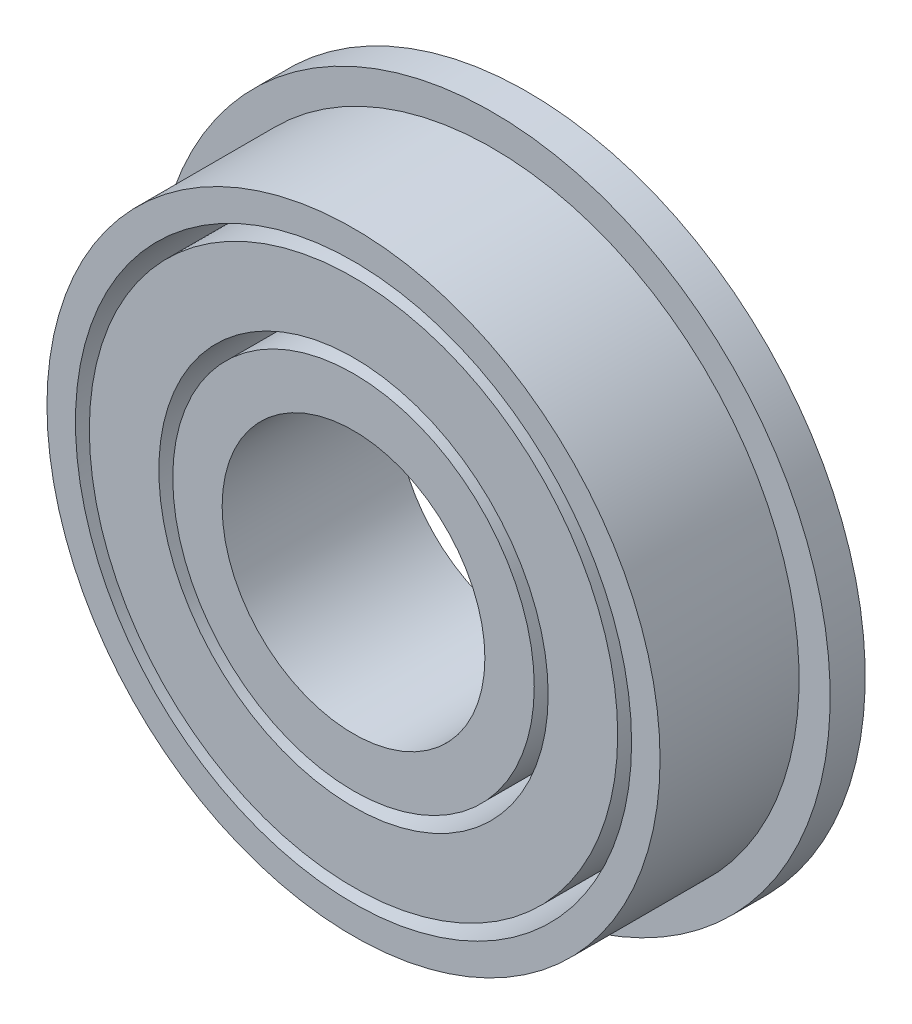
ISO-10303-21;
HEADER;
FILE_DESCRIPTION(('STEP AP214'),'2;1');
FILE_NAME('part.step','',(''),(''),'','','');
FILE_SCHEMA(('AUTOMOTIVE_DESIGN { 1 0 10303 214 1 1 1 1 }'));
ENDSEC;
DATA;
#1=APPLICATION_CONTEXT('core data for automotive mechanical design processes');
#2=APPLICATION_PROTOCOL_DEFINITION('international standard','automotive_design',2000,#1);
#3=PRODUCT_CONTEXT('',#1,'mechanical');
#4=PRODUCT('Part','Part','',(#3));
#5=PRODUCT_RELATED_PRODUCT_CATEGORY('part','',(#4));
#6=PRODUCT_DEFINITION_FORMATION('','',#4);
#7=PRODUCT_DEFINITION_CONTEXT('part definition',#1,'design');
#8=PRODUCT_DEFINITION('design','',#6,#7);
#9=PRODUCT_DEFINITION_SHAPE('','',#8);
#10=(LENGTH_UNIT() NAMED_UNIT(*) SI_UNIT(.MILLI.,.METRE.));
#11=(NAMED_UNIT(*) PLANE_ANGLE_UNIT() SI_UNIT($,.RADIAN.));
#12=(NAMED_UNIT(*) SI_UNIT($,.STERADIAN.) SOLID_ANGLE_UNIT());
#13=UNCERTAINTY_MEASURE_WITH_UNIT(LENGTH_MEASURE(1.E-05),#10,'distance_accuracy_value','');
#14=(GEOMETRIC_REPRESENTATION_CONTEXT(3) GLOBAL_UNCERTAINTY_ASSIGNED_CONTEXT((#13)) GLOBAL_UNIT_ASSIGNED_CONTEXT((#10,
#11,#12)) REPRESENTATION_CONTEXT('',''));
#15=CARTESIAN_POINT('',(0.,0.,0.));
#16=DIRECTION('',(0.,0.,1.));
#17=DIRECTION('',(1.,0.,0.));
#18=AXIS2_PLACEMENT_3D('',#15,#16,#17);
#19=CARTESIAN_POINT('',(0.,0.,7.9502));
#20=DIRECTION('',(0.,0.,-1.));
#21=DIRECTION('',(-1.,0.,0.));
#22=AXIS2_PLACEMENT_3D('',#19,#20,#21);
#23=CYLINDRICAL_SURFACE('',#22,14.);
#24=CARTESIAN_POINT('',(0.,0.,7.9502));
#25=DIRECTION('',(0.,0.,1.));
#26=DIRECTION('',(1.,0.,0.));
#27=AXIS2_PLACEMENT_3D('',#24,#25,#26);
#28=CIRCLE('',#27,14.);
#29=CARTESIAN_POINT('',(14.,0.,7.9502));
#30=VERTEX_POINT('',#29);
#31=EDGE_CURVE('E78',#30,#30,#28,.T.);
#32=ORIENTED_EDGE('',*,*,#31,.F.);
#33=EDGE_LOOP('',(#32));
#34=FACE_BOUND('',#33,.T.);
#35=CARTESIAN_POINT('',(0.,0.,1.6002));
#36=DIRECTION('',(0.,0.,-1.));
#37=DIRECTION('',(-1.,0.,0.));
#38=AXIS2_PLACEMENT_3D('',#35,#36,#37);
#39=CIRCLE('',#38,14.);
#40=CARTESIAN_POINT('',(-14.,0.,1.6002));
#41=VERTEX_POINT('',#40);
#42=EDGE_CURVE('E65',#41,#41,#39,.T.);
#43=ORIENTED_EDGE('',*,*,#42,.F.);
#44=EDGE_LOOP('',(#43));
#45=FACE_BOUND('',#44,.T.);
#46=ADVANCED_FACE('F58',(#34,#45),#23,.T.);
#47=CARTESIAN_POINT('',(0.,0.,7.9502));
#48=DIRECTION('',(0.,0.,1.));
#49=DIRECTION('',(1.,0.,0.));
#50=AXIS2_PLACEMENT_3D('',#47,#48,#49);
#51=PLANE('',#50);
#52=CARTESIAN_POINT('',(0.,0.,7.9502));
#53=DIRECTION('',(0.,0.,1.));
#54=DIRECTION('',(1.,0.,0.));
#55=AXIS2_PLACEMENT_3D('',#52,#53,#54);
#56=CIRCLE('',#55,12.7);
#57=CARTESIAN_POINT('',(12.7,0.,7.9502));
#58=VERTEX_POINT('',#57);
#59=EDGE_CURVE('E12',#58,#58,#56,.T.);
#60=ORIENTED_EDGE('',*,*,#59,.F.);
#61=EDGE_LOOP('',(#60));
#62=FACE_BOUND('',#61,.T.);
#63=ORIENTED_EDGE('',*,*,#31,.T.);
#64=EDGE_LOOP('',(#63));
#65=FACE_BOUND('',#64,.T.);
#66=ADVANCED_FACE('F60',(#62,#65),#51,.T.);
#67=CARTESIAN_POINT('',(0.,0.,0.));
#68=DIRECTION('',(0.,0.,1.));
#69=DIRECTION('',(1.,0.,0.));
#70=AXIS2_PLACEMENT_3D('',#67,#68,#69);
#71=PLANE('',#70);
#72=CARTESIAN_POINT('',(0.,0.,0.));
#73=DIRECTION('',(0.,0.,1.));
#74=DIRECTION('',(1.,0.,0.));
#75=AXIS2_PLACEMENT_3D('',#72,#73,#74);
#76=CIRCLE('',#75,12.7);
#77=CARTESIAN_POINT('',(12.7,0.,0.));
#78=VERTEX_POINT('',#77);
#79=EDGE_CURVE('E77',#78,#78,#76,.T.);
#80=ORIENTED_EDGE('',*,*,#79,.T.);
#81=EDGE_LOOP('',(#80));
#82=FACE_BOUND('',#81,.T.);
#83=CARTESIAN_POINT('',(0.,0.,0.));
#84=DIRECTION('',(0.,0.,-1.));
#85=DIRECTION('',(-1.,0.,0.));
#86=AXIS2_PLACEMENT_3D('',#83,#84,#85);
#87=CIRCLE('',#86,15.42);
#88=CARTESIAN_POINT('',(-15.42,0.,0.));
#89=VERTEX_POINT('',#88);
#90=EDGE_CURVE('E74',#89,#89,#87,.T.);
#91=ORIENTED_EDGE('',*,*,#90,.T.);
#92=EDGE_LOOP('',(#91));
#93=FACE_BOUND('',#92,.T.);
#94=ADVANCED_FACE('F87',(#82,#93),#71,.F.);
#95=CARTESIAN_POINT('',(0.,0.,1.6002));
#96=DIRECTION('',(0.,0.,-1.));
#97=DIRECTION('',(-1.,0.,0.));
#98=AXIS2_PLACEMENT_3D('',#95,#96,#97);
#99=CYLINDRICAL_SURFACE('',#98,15.42);
#100=CARTESIAN_POINT('',(0.,0.,1.6002));
#101=DIRECTION('',(0.,0.,-1.));
#102=DIRECTION('',(-1.,0.,0.));
#103=AXIS2_PLACEMENT_3D('',#100,#101,#102);
#104=CIRCLE('',#103,15.42);
#105=CARTESIAN_POINT('',(-15.42,0.,1.6002));
#106=VERTEX_POINT('',#105);
#107=EDGE_CURVE('E69',#106,#106,#104,.T.);
#108=ORIENTED_EDGE('',*,*,#107,.T.);
#109=EDGE_LOOP('',(#108));
#110=FACE_BOUND('',#109,.T.);
#111=ORIENTED_EDGE('',*,*,#90,.F.);
#112=EDGE_LOOP('',(#111));
#113=FACE_BOUND('',#112,.T.);
#114=ADVANCED_FACE('F96',(#110,#113),#99,.T.);
#115=CARTESIAN_POINT('',(0.,0.,1.6002));
#116=DIRECTION('',(0.,0.,-1.));
#117=DIRECTION('',(-1.,0.,0.));
#118=AXIS2_PLACEMENT_3D('',#115,#116,#117);
#119=PLANE('',#118);
#120=ORIENTED_EDGE('',*,*,#42,.T.);
#121=EDGE_LOOP('',(#120));
#122=FACE_BOUND('',#121,.T.);
#123=ORIENTED_EDGE('',*,*,#107,.F.);
#124=EDGE_LOOP('',(#123));
#125=FACE_BOUND('',#124,.T.);
#126=ADVANCED_FACE('F91',(#122,#125),#119,.F.);
#127=CARTESIAN_POINT('',(0.,0.,-17.4498));
#128=DIRECTION('',(0.,0.,1.));
#129=DIRECTION('',(1.,0.,0.));
#130=AXIS2_PLACEMENT_3D('',#127,#128,#129);
#131=CYLINDRICAL_SURFACE('',#130,12.7);
#132=ORIENTED_EDGE('',*,*,#59,.T.);
#133=EDGE_LOOP('',(#132));
#134=FACE_BOUND('',#133,.T.);
#135=ORIENTED_EDGE('',*,*,#79,.F.);
#136=EDGE_LOOP('',(#135));
#137=FACE_BOUND('',#136,.T.);
#138=ADVANCED_FACE('F89',(#134,#137),#131,.F.);
#139=CLOSED_SHELL('',(#46,#66,#94,#114,#126,#138));
#140=MANIFOLD_SOLID_BREP('B2',#139);
#141=CARTESIAN_POINT('',(0.,0.,0.));
#142=DIRECTION('',(0.,0.,1.));
#143=DIRECTION('',(1.,0.,0.));
#144=AXIS2_PLACEMENT_3D('',#141,#142,#143);
#145=PLANE('',#144);
#146=CARTESIAN_POINT('',(0.,0.,0.));
#147=DIRECTION('',(0.,0.,1.));
#148=DIRECTION('',(1.,0.,0.));
#149=AXIS2_PLACEMENT_3D('',#146,#147,#148);
#150=CIRCLE('',#149,8.89);
#151=CARTESIAN_POINT('',(8.89,0.,0.));
#152=VERTEX_POINT('',#151);
#153=EDGE_CURVE('E175',#152,#152,#150,.T.);
#154=ORIENTED_EDGE('',*,*,#153,.T.);
#155=EDGE_LOOP('',(#154));
#156=FACE_BOUND('',#155,.T.);
#157=CARTESIAN_POINT('',(0.,0.,0.));
#158=DIRECTION('',(0.,0.,1.));
#159=DIRECTION('',(1.,0.,0.));
#160=AXIS2_PLACEMENT_3D('',#157,#158,#159);
#161=CIRCLE('',#160,12.065);
#162=CARTESIAN_POINT('',(12.065,0.,0.));
#163=VERTEX_POINT('',#162);
#164=EDGE_CURVE('E171',#163,#163,#161,.T.);
#165=ORIENTED_EDGE('',*,*,#164,.F.);
#166=EDGE_LOOP('',(#165));
#167=FACE_BOUND('',#166,.T.);
#168=ADVANCED_FACE('F160',(#156,#167),#145,.F.);
#169=CARTESIAN_POINT('',(0.,0.,-17.4498));
#170=DIRECTION('',(0.,0.,1.));
#171=DIRECTION('',(1.,0.,0.));
#172=AXIS2_PLACEMENT_3D('',#169,#170,#171);
#173=CYLINDRICAL_SURFACE('',#172,12.065);
#174=CARTESIAN_POINT('',(0.,0.,7.9502));
#175=DIRECTION('',(0.,0.,1.));
#176=DIRECTION('',(1.,0.,0.));
#177=AXIS2_PLACEMENT_3D('',#174,#175,#176);
#178=CIRCLE('',#177,12.065);
#179=CARTESIAN_POINT('',(12.065,0.,7.9502));
#180=VERTEX_POINT('',#179);
#181=EDGE_CURVE('E57',#180,#180,#178,.T.);
#182=ORIENTED_EDGE('',*,*,#181,.F.);
#183=EDGE_LOOP('',(#182));
#184=FACE_BOUND('',#183,.T.);
#185=ORIENTED_EDGE('',*,*,#164,.T.);
#186=EDGE_LOOP('',(#185));
#187=FACE_BOUND('',#186,.T.);
#188=ADVANCED_FACE('F183',(#184,#187),#173,.T.);
#189=CARTESIAN_POINT('',(0.,0.,-17.4498));
#190=DIRECTION('',(0.,0.,1.));
#191=DIRECTION('',(1.,0.,0.));
#192=AXIS2_PLACEMENT_3D('',#189,#190,#191);
#193=CYLINDRICAL_SURFACE('',#192,8.89);
#194=CARTESIAN_POINT('',(0.,0.,7.9502));
#195=DIRECTION('',(0.,0.,1.));
#196=DIRECTION('',(1.,0.,0.));
#197=AXIS2_PLACEMENT_3D('',#194,#195,#196);
#198=CIRCLE('',#197,8.89);
#199=CARTESIAN_POINT('',(8.89,0.,7.9502));
#200=VERTEX_POINT('',#199);
#201=EDGE_CURVE('E164',#200,#200,#198,.T.);
#202=ORIENTED_EDGE('',*,*,#201,.T.);
#203=EDGE_LOOP('',(#202));
#204=FACE_BOUND('',#203,.T.);
#205=ORIENTED_EDGE('',*,*,#153,.F.);
#206=EDGE_LOOP('',(#205));
#207=FACE_BOUND('',#206,.T.);
#208=ADVANCED_FACE('F181',(#204,#207),#193,.F.);
#209=CARTESIAN_POINT('',(0.,0.,7.9502));
#210=DIRECTION('',(0.,0.,1.));
#211=DIRECTION('',(1.,0.,0.));
#212=AXIS2_PLACEMENT_3D('',#209,#210,#211);
#213=PLANE('',#212);
#214=ORIENTED_EDGE('',*,*,#201,.F.);
#215=EDGE_LOOP('',(#214));
#216=FACE_BOUND('',#215,.T.);
#217=ORIENTED_EDGE('',*,*,#181,.T.);
#218=EDGE_LOOP('',(#217));
#219=FACE_BOUND('',#218,.T.);
#220=ADVANCED_FACE('F162',(#216,#219),#213,.T.);
#221=CLOSED_SHELL('',(#168,#188,#208,#220));
#222=MANIFOLD_SOLID_BREP('B7',#221);
#223=CARTESIAN_POINT('',(0.,0.,7.9502));
#224=DIRECTION('',(0.,0.,1.));
#225=DIRECTION('',(1.,0.,0.));
#226=AXIS2_PLACEMENT_3D('',#223,#224,#225);
#227=PLANE('',#226);
#228=CARTESIAN_POINT('',(0.,0.,7.9502));
#229=DIRECTION('',(0.,0.,1.));
#230=DIRECTION('',(1.,0.,0.));
#231=AXIS2_PLACEMENT_3D('',#228,#229,#230);
#232=CIRCLE('',#231,6.);
#233=CARTESIAN_POINT('',(6.,0.,7.9502));
#234=VERTEX_POINT('',#233);
#235=EDGE_CURVE('E159',#234,#234,#232,.T.);
#236=ORIENTED_EDGE('',*,*,#235,.F.);
#237=EDGE_LOOP('',(#236));
#238=FACE_BOUND('',#237,.T.);
#239=CARTESIAN_POINT('',(0.,0.,7.9502));
#240=DIRECTION('',(0.,0.,1.));
#241=DIRECTION('',(1.,0.,0.));
#242=AXIS2_PLACEMENT_3D('',#239,#240,#241);
#243=CIRCLE('',#242,8.255);
#244=CARTESIAN_POINT('',(8.255,0.,7.9502));
#245=VERTEX_POINT('',#244);
#246=EDGE_CURVE('E251',#245,#245,#243,.T.);
#247=ORIENTED_EDGE('',*,*,#246,.T.);
#248=EDGE_LOOP('',(#247));
#249=FACE_BOUND('',#248,.T.);
#250=ADVANCED_FACE('F237',(#238,#249),#227,.T.);
#251=CARTESIAN_POINT('',(0.,0.,7.9502));
#252=DIRECTION('',(0.,0.,-1.));
#253=DIRECTION('',(-1.,0.,0.));
#254=AXIS2_PLACEMENT_3D('',#251,#252,#253);
#255=CYLINDRICAL_SURFACE('',#254,6.);
#256=ORIENTED_EDGE('',*,*,#235,.T.);
#257=EDGE_LOOP('',(#256));
#258=FACE_BOUND('',#257,.T.);
#259=CARTESIAN_POINT('',(0.,0.,0.));
#260=DIRECTION('',(0.,0.,1.));
#261=DIRECTION('',(1.,0.,0.));
#262=AXIS2_PLACEMENT_3D('',#259,#260,#261);
#263=CIRCLE('',#262,6.);
#264=CARTESIAN_POINT('',(6.,0.,0.));
#265=VERTEX_POINT('',#264);
#266=EDGE_CURVE('E245',#265,#265,#263,.T.);
#267=ORIENTED_EDGE('',*,*,#266,.F.);
#268=EDGE_LOOP('',(#267));
#269=FACE_BOUND('',#268,.T.);
#270=ADVANCED_FACE('F261',(#258,#269),#255,.F.);
#271=CARTESIAN_POINT('',(0.,0.,0.));
#272=DIRECTION('',(0.,0.,1.));
#273=DIRECTION('',(1.,0.,0.));
#274=AXIS2_PLACEMENT_3D('',#271,#272,#273);
#275=PLANE('',#274);
#276=ORIENTED_EDGE('',*,*,#266,.T.);
#277=EDGE_LOOP('',(#276));
#278=FACE_BOUND('',#277,.T.);
#279=CARTESIAN_POINT('',(0.,0.,0.));
#280=DIRECTION('',(0.,0.,1.));
#281=DIRECTION('',(1.,0.,0.));
#282=AXIS2_PLACEMENT_3D('',#279,#280,#281);
#283=CIRCLE('',#282,8.255);
#284=CARTESIAN_POINT('',(8.255,0.,0.));
#285=VERTEX_POINT('',#284);
#286=EDGE_CURVE('E241',#285,#285,#283,.T.);
#287=ORIENTED_EDGE('',*,*,#286,.F.);
#288=EDGE_LOOP('',(#287));
#289=FACE_BOUND('',#288,.T.);
#290=ADVANCED_FACE('F239',(#278,#289),#275,.F.);
#291=CARTESIAN_POINT('',(0.,0.,-17.4498));
#292=DIRECTION('',(0.,0.,1.));
#293=DIRECTION('',(1.,0.,0.));
#294=AXIS2_PLACEMENT_3D('',#291,#292,#293);
#295=CYLINDRICAL_SURFACE('',#294,8.255);
#296=ORIENTED_EDGE('',*,*,#246,.F.);
#297=EDGE_LOOP('',(#296));
#298=FACE_BOUND('',#297,.T.);
#299=ORIENTED_EDGE('',*,*,#286,.T.);
#300=EDGE_LOOP('',(#299));
#301=FACE_BOUND('',#300,.T.);
#302=ADVANCED_FACE('F258',(#298,#301),#295,.T.);
#303=CLOSED_SHELL('',(#250,#270,#290,#302));
#304=MANIFOLD_SOLID_BREP('B52',#303);
#305=ADVANCED_BREP_SHAPE_REPRESENTATION('',(#18,#140,#222,#304),#14);
#306=SHAPE_DEFINITION_REPRESENTATION(#9,#305);
ENDSEC;
END-ISO-10303-21;
